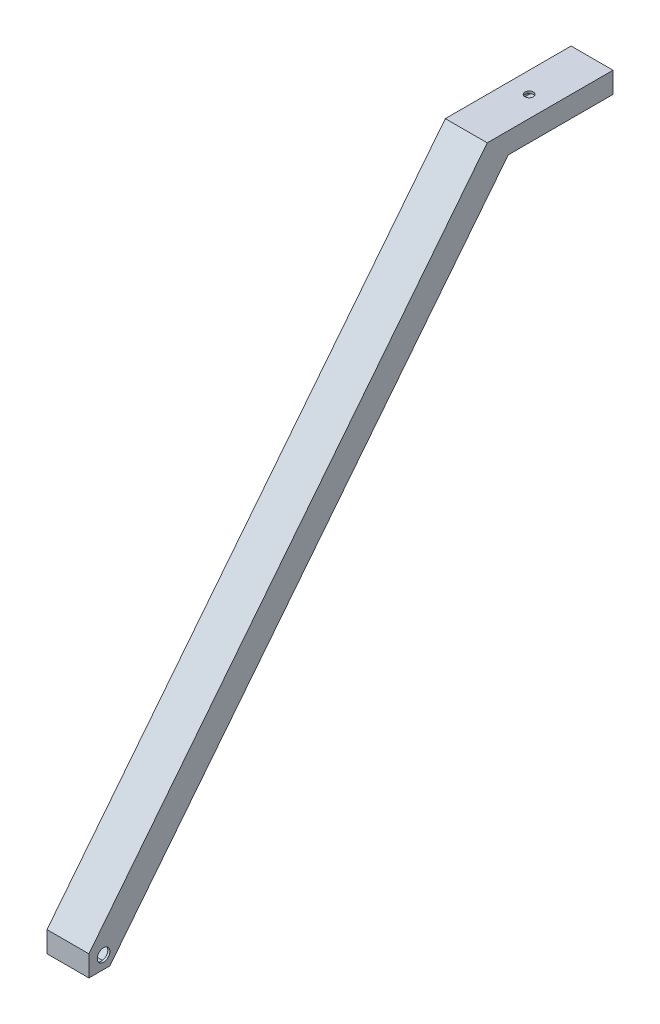
ISO-10303-21;
HEADER;
FILE_DESCRIPTION(('STEP AP214'),'2;1');
FILE_NAME('part.step','',(''),(''),'','','');
FILE_SCHEMA(('AUTOMOTIVE_DESIGN { 1 0 10303 214 1 1 1 1 }'));
ENDSEC;
DATA;
#1=APPLICATION_CONTEXT('core data for automotive mechanical design processes');
#2=APPLICATION_PROTOCOL_DEFINITION('international standard','automotive_design',2000,#1);
#3=PRODUCT_CONTEXT('',#1,'mechanical');
#4=PRODUCT('Part','Part','',(#3));
#5=PRODUCT_RELATED_PRODUCT_CATEGORY('part','',(#4));
#6=PRODUCT_DEFINITION_FORMATION('','',#4);
#7=PRODUCT_DEFINITION_CONTEXT('part definition',#1,'design');
#8=PRODUCT_DEFINITION('design','',#6,#7);
#9=PRODUCT_DEFINITION_SHAPE('','',#8);
#10=(LENGTH_UNIT() NAMED_UNIT(*) SI_UNIT(.MILLI.,.METRE.));
#11=(NAMED_UNIT(*) PLANE_ANGLE_UNIT() SI_UNIT($,.RADIAN.));
#12=(NAMED_UNIT(*) SI_UNIT($,.STERADIAN.) SOLID_ANGLE_UNIT());
#13=UNCERTAINTY_MEASURE_WITH_UNIT(LENGTH_MEASURE(1.E-05),#10,'distance_accuracy_value','');
#14=(GEOMETRIC_REPRESENTATION_CONTEXT(3) GLOBAL_UNCERTAINTY_ASSIGNED_CONTEXT((#13)) GLOBAL_UNIT_ASSIGNED_CONTEXT((#10,
#11,#12)) REPRESENTATION_CONTEXT('',''));
#15=CARTESIAN_POINT('',(0.,0.,0.));
#16=DIRECTION('',(0.,0.,1.));
#17=DIRECTION('',(1.,0.,0.));
#18=AXIS2_PLACEMENT_3D('',#15,#16,#17);
#19=CARTESIAN_POINT('',(10.,10.,0.));
#20=DIRECTION('',(0.,0.,1.));
#21=DIRECTION('',(0.,-1.,0.));
#22=AXIS2_PLACEMENT_3D('',#19,#20,#21);
#23=PLANE('',#22);
#24=DIRECTION('',(0.,1.,0.));
#25=VECTOR('',#24,1.);
#26=CARTESIAN_POINT('',(-10.,10.,0.));
#27=LINE('',#26,#25);
#28=CARTESIAN_POINT('',(-10.,0.,0.));
#29=VERTEX_POINT('',#28);
#30=CARTESIAN_POINT('',(-10.,10.,0.));
#31=VERTEX_POINT('',#30);
#32=EDGE_CURVE('E149',#29,#31,#27,.T.);
#33=ORIENTED_EDGE('',*,*,#32,.T.);
#34=DIRECTION('',(-1.,0.,0.));
#35=VECTOR('',#34,1.);
#36=CARTESIAN_POINT('',(10.,10.,0.));
#37=LINE('',#36,#35);
#38=CARTESIAN_POINT('',(10.,10.,0.));
#39=VERTEX_POINT('',#38);
#40=EDGE_CURVE('E161',#39,#31,#37,.T.);
#41=ORIENTED_EDGE('',*,*,#40,.F.);
#42=DIRECTION('',(0.,1.,0.));
#43=VECTOR('',#42,1.);
#44=CARTESIAN_POINT('',(10.,10.,0.));
#45=LINE('',#44,#43);
#46=CARTESIAN_POINT('',(10.,0.,0.));
#47=VERTEX_POINT('',#46);
#48=EDGE_CURVE('E247',#47,#39,#45,.T.);
#49=ORIENTED_EDGE('',*,*,#48,.F.);
#50=DIRECTION('',(-1.,0.,0.));
#51=VECTOR('',#50,1.);
#52=CARTESIAN_POINT('',(10.,0.,0.));
#53=LINE('',#52,#51);
#54=EDGE_CURVE('E47',#47,#29,#53,.T.);
#55=ORIENTED_EDGE('',*,*,#54,.T.);
#56=EDGE_LOOP('',(#33,#41,#49,#55));
#57=FACE_BOUND('',#56,.T.);
#58=DIRECTION('',(0.,1.,0.));
#59=VECTOR('',#58,1.);
#60=CARTESIAN_POINT('',(-9.,10.,0.));
#61=LINE('',#60,#59);
#62=CARTESIAN_POINT('',(-9.,1.,0.));
#63=VERTEX_POINT('',#62);
#64=CARTESIAN_POINT('',(-9.,9.,0.));
#65=VERTEX_POINT('',#64);
#66=EDGE_CURVE('E205',#63,#65,#61,.T.);
#67=ORIENTED_EDGE('',*,*,#66,.F.);
#68=DIRECTION('',(-1.,0.,0.));
#69=VECTOR('',#68,1.);
#70=CARTESIAN_POINT('',(10.,1.,0.));
#71=LINE('',#70,#69);
#72=CARTESIAN_POINT('',(9.,1.,0.));
#73=VERTEX_POINT('',#72);
#74=EDGE_CURVE('E192',#73,#63,#71,.T.);
#75=ORIENTED_EDGE('',*,*,#74,.F.);
#76=DIRECTION('',(0.,1.,0.));
#77=VECTOR('',#76,1.);
#78=CARTESIAN_POINT('',(9.,10.,0.));
#79=LINE('',#78,#77);
#80=CARTESIAN_POINT('',(9.,9.,0.));
#81=VERTEX_POINT('',#80);
#82=EDGE_CURVE('E55',#73,#81,#79,.T.);
#83=ORIENTED_EDGE('',*,*,#82,.T.);
#84=DIRECTION('',(-1.,0.,0.));
#85=VECTOR('',#84,1.);
#86=CARTESIAN_POINT('',(10.,9.,0.));
#87=LINE('',#86,#85);
#88=EDGE_CURVE('E225',#81,#65,#87,.T.);
#89=ORIENTED_EDGE('',*,*,#88,.T.);
#90=EDGE_LOOP('',(#67,#75,#83,#89));
#91=FACE_BOUND('',#90,.T.);
#92=ADVANCED_FACE('F38',(#57,#91),#23,.F.);
#93=CARTESIAN_POINT('',(10.,0.,50.));
#94=DIRECTION('',(0.,0.620702944365561,0.784045824461761));
#95=DIRECTION('',(0.,-0.784045824461762,0.620702944365561));
#96=AXIS2_PLACEMENT_3D('',#93,#94,#95);
#97=PLANE('',#96);
#98=DIRECTION('',(0.,0.784045824461761,-0.620702944365561));
#99=VECTOR('',#98,1.);
#100=CARTESIAN_POINT('',(-10.,0.,50.));
#101=LINE('',#100,#99);
#102=CARTESIAN_POINT('',(-10.,-240.,240.));
#103=VERTEX_POINT('',#102);
#104=CARTESIAN_POINT('',(-10.,0.,50.));
#105=VERTEX_POINT('',#104);
#106=EDGE_CURVE('E143',#103,#105,#101,.T.);
#107=ORIENTED_EDGE('',*,*,#106,.T.);
#108=DIRECTION('',(-1.,0.,0.));
#109=VECTOR('',#108,1.);
#110=CARTESIAN_POINT('',(10.,0.,50.));
#111=LINE('',#110,#109);
#112=CARTESIAN_POINT('',(10.,0.,50.));
#113=VERTEX_POINT('',#112);
#114=EDGE_CURVE('E11',#113,#105,#111,.T.);
#115=ORIENTED_EDGE('',*,*,#114,.F.);
#116=DIRECTION('',(0.,0.784045824461761,-0.620702944365561));
#117=VECTOR('',#116,1.);
#118=CARTESIAN_POINT('',(10.,0.,50.));
#119=LINE('',#118,#117);
#120=CARTESIAN_POINT('',(10.,-240.,240.));
#121=VERTEX_POINT('',#120);
#122=EDGE_CURVE('E157',#121,#113,#119,.T.);
#123=ORIENTED_EDGE('',*,*,#122,.F.);
#124=DIRECTION('',(-1.,0.,0.));
#125=VECTOR('',#124,1.);
#126=CARTESIAN_POINT('',(10.,-240.,240.));
#127=LINE('',#126,#125);
#128=EDGE_CURVE('E139',#121,#103,#127,.T.);
#129=ORIENTED_EDGE('',*,*,#128,.T.);
#130=EDGE_LOOP('',(#107,#115,#123,#129));
#131=FACE_BOUND('',#130,.T.);
#132=ADVANCED_FACE('F40',(#131),#97,.F.);
#133=CARTESIAN_POINT('',(10.,0.,0.));
#134=DIRECTION('',(0.,1.,0.));
#135=DIRECTION('',(0.,0.,1.));
#136=AXIS2_PLACEMENT_3D('',#133,#134,#135);
#137=PLANE('',#136);
#138=CARTESIAN_POINT('',(0.,0.,30.));
#139=DIRECTION('',(0.,1.,0.));
#140=DIRECTION('',(0.,0.,1.));
#141=AXIS2_PLACEMENT_3D('',#138,#139,#140);
#142=CIRCLE('',#141,2.);
#143=CARTESIAN_POINT('',(0.,0.,32.));
#144=VERTEX_POINT('',#143);
#145=EDGE_CURVE('E172',#144,#144,#142,.T.);
#146=ORIENTED_EDGE('',*,*,#145,.T.);
#147=EDGE_LOOP('',(#146));
#148=FACE_BOUND('',#147,.T.);
#149=DIRECTION('',(0.,0.,-1.));
#150=VECTOR('',#149,1.);
#151=CARTESIAN_POINT('',(-10.,0.,0.));
#152=LINE('',#151,#150);
#153=EDGE_CURVE('E146',#105,#29,#152,.T.);
#154=ORIENTED_EDGE('',*,*,#153,.T.);
#155=ORIENTED_EDGE('',*,*,#54,.F.);
#156=DIRECTION('',(0.,0.,-1.));
#157=VECTOR('',#156,1.);
#158=CARTESIAN_POINT('',(10.,0.,0.));
#159=LINE('',#158,#157);
#160=EDGE_CURVE('E102',#113,#47,#159,.T.);
#161=ORIENTED_EDGE('',*,*,#160,.F.);
#162=ORIENTED_EDGE('',*,*,#114,.T.);
#163=EDGE_LOOP('',(#154,#155,#161,#162));
#164=FACE_BOUND('',#163,.T.);
#165=ADVANCED_FACE('F263',(#148,#164),#137,.F.);
#166=CARTESIAN_POINT('',(10.,10.,60.));
#167=DIRECTION('',(0.,-1.,0.));
#168=DIRECTION('',(0.,0.,-1.));
#169=AXIS2_PLACEMENT_3D('',#166,#167,#168);
#170=PLANE('',#169);
#171=CARTESIAN_POINT('',(0.,10.,30.));
#172=DIRECTION('',(0.,1.,0.));
#173=DIRECTION('',(0.,0.,1.));
#174=AXIS2_PLACEMENT_3D('',#171,#172,#173);
#175=CIRCLE('',#174,2.);
#176=CARTESIAN_POINT('',(0.,10.,32.));
#177=VERTEX_POINT('',#176);
#178=EDGE_CURVE('E168',#177,#177,#175,.T.);
#179=ORIENTED_EDGE('',*,*,#178,.F.);
#180=EDGE_LOOP('',(#179));
#181=FACE_BOUND('',#180,.T.);
#182=DIRECTION('',(0.,0.,1.));
#183=VECTOR('',#182,1.);
#184=CARTESIAN_POINT('',(-10.,10.,60.));
#185=LINE('',#184,#183);
#186=CARTESIAN_POINT('',(-10.,10.,60.));
#187=VERTEX_POINT('',#186);
#188=EDGE_CURVE('E151',#31,#187,#185,.T.);
#189=ORIENTED_EDGE('',*,*,#188,.T.);
#190=DIRECTION('',(-1.,0.,0.));
#191=VECTOR('',#190,1.);
#192=CARTESIAN_POINT('',(10.,10.,60.));
#193=LINE('',#192,#191);
#194=CARTESIAN_POINT('',(10.,10.,60.));
#195=VERTEX_POINT('',#194);
#196=EDGE_CURVE('E134',#195,#187,#193,.T.);
#197=ORIENTED_EDGE('',*,*,#196,.F.);
#198=DIRECTION('',(0.,0.,1.));
#199=VECTOR('',#198,1.);
#200=CARTESIAN_POINT('',(10.,10.,60.));
#201=LINE('',#200,#199);
#202=EDGE_CURVE('E122',#39,#195,#201,.T.);
#203=ORIENTED_EDGE('',*,*,#202,.F.);
#204=ORIENTED_EDGE('',*,*,#40,.T.);
#205=EDGE_LOOP('',(#189,#197,#203,#204));
#206=FACE_BOUND('',#205,.T.);
#207=ADVANCED_FACE('F255',(#181,#206),#170,.F.);
#208=CARTESIAN_POINT('',(10.,-230.,250.));
#209=DIRECTION('',(0.,-0.620702944365561,-0.784045824461761));
#210=DIRECTION('',(0.,0.784045824461762,-0.620702944365561));
#211=AXIS2_PLACEMENT_3D('',#208,#209,#210);
#212=PLANE('',#211);
#213=DIRECTION('',(0.,-0.784045824461761,0.620702944365561));
#214=VECTOR('',#213,1.);
#215=CARTESIAN_POINT('',(-10.,-230.,250.));
#216=LINE('',#215,#214);
#217=CARTESIAN_POINT('',(-10.,-230.,250.));
#218=VERTEX_POINT('',#217);
#219=EDGE_CURVE('E131',#187,#218,#216,.T.);
#220=ORIENTED_EDGE('',*,*,#219,.T.);
#221=DIRECTION('',(-1.,0.,0.));
#222=VECTOR('',#221,1.);
#223=CARTESIAN_POINT('',(10.,-230.,250.));
#224=LINE('',#223,#222);
#225=CARTESIAN_POINT('',(10.,-230.,250.));
#226=VERTEX_POINT('',#225);
#227=EDGE_CURVE('E128',#226,#218,#224,.T.);
#228=ORIENTED_EDGE('',*,*,#227,.F.);
#229=DIRECTION('',(0.,-0.784045824461761,0.620702944365561));
#230=VECTOR('',#229,1.);
#231=CARTESIAN_POINT('',(10.,-230.,250.));
#232=LINE('',#231,#230);
#233=EDGE_CURVE('E115',#195,#226,#232,.T.);
#234=ORIENTED_EDGE('',*,*,#233,.F.);
#235=ORIENTED_EDGE('',*,*,#196,.T.);
#236=EDGE_LOOP('',(#220,#228,#234,#235));
#237=FACE_BOUND('',#236,.T.);
#238=ADVANCED_FACE('F129',(#237),#212,.F.);
#239=CARTESIAN_POINT('',(10.,-230.,250.));
#240=DIRECTION('',(0.,0.,-1.));
#241=DIRECTION('',(0.,1.,0.));
#242=AXIS2_PLACEMENT_3D('',#239,#240,#241);
#243=PLANE('',#242);
#244=DIRECTION('',(0.,-1.,0.));
#245=VECTOR('',#244,1.);
#246=CARTESIAN_POINT('',(-10.,-230.,250.));
#247=LINE('',#246,#245);
#248=CARTESIAN_POINT('',(-10.,-240.,250.));
#249=VERTEX_POINT('',#248);
#250=EDGE_CURVE('E154',#218,#249,#247,.T.);
#251=ORIENTED_EDGE('',*,*,#250,.T.);
#252=DIRECTION('',(-1.,0.,0.));
#253=VECTOR('',#252,1.);
#254=CARTESIAN_POINT('',(10.,-240.,250.));
#255=LINE('',#254,#253);
#256=CARTESIAN_POINT('',(10.,-240.,250.));
#257=VERTEX_POINT('',#256);
#258=EDGE_CURVE('E135',#257,#249,#255,.T.);
#259=ORIENTED_EDGE('',*,*,#258,.F.);
#260=DIRECTION('',(0.,-1.,0.));
#261=VECTOR('',#260,1.);
#262=CARTESIAN_POINT('',(10.,-230.,250.));
#263=LINE('',#262,#261);
#264=EDGE_CURVE('E119',#226,#257,#263,.T.);
#265=ORIENTED_EDGE('',*,*,#264,.F.);
#266=ORIENTED_EDGE('',*,*,#227,.T.);
#267=EDGE_LOOP('',(#251,#259,#265,#266));
#268=FACE_BOUND('',#267,.T.);
#269=ADVANCED_FACE('F137',(#268),#243,.F.);
#270=CARTESIAN_POINT('',(10.,-240.,250.));
#271=DIRECTION('',(0.,1.,0.));
#272=DIRECTION('',(0.,0.,1.));
#273=AXIS2_PLACEMENT_3D('',#270,#271,#272);
#274=PLANE('',#273);
#275=DIRECTION('',(0.,0.,-1.));
#276=VECTOR('',#275,1.);
#277=CARTESIAN_POINT('',(-10.,-240.,250.));
#278=LINE('',#277,#276);
#279=EDGE_CURVE('E94',#249,#103,#278,.T.);
#280=ORIENTED_EDGE('',*,*,#279,.T.);
#281=ORIENTED_EDGE('',*,*,#128,.F.);
#282=DIRECTION('',(0.,0.,-1.));
#283=VECTOR('',#282,1.);
#284=CARTESIAN_POINT('',(10.,-240.,250.));
#285=LINE('',#284,#283);
#286=EDGE_CURVE('E64',#257,#121,#285,.T.);
#287=ORIENTED_EDGE('',*,*,#286,.F.);
#288=ORIENTED_EDGE('',*,*,#258,.T.);
#289=EDGE_LOOP('',(#280,#281,#287,#288));
#290=FACE_BOUND('',#289,.T.);
#291=ADVANCED_FACE('F259',(#290),#274,.F.);
#292=CARTESIAN_POINT('',(10.,0.,0.));
#293=DIRECTION('',(1.,0.,0.));
#294=DIRECTION('',(0.,0.,-1.));
#295=AXIS2_PLACEMENT_3D('',#292,#293,#294);
#296=PLANE('',#295);
#297=CARTESIAN_POINT('',(10.,-234.,243.));
#298=DIRECTION('',(1.,0.,0.));
#299=DIRECTION('',(0.,0.,-1.));
#300=AXIS2_PLACEMENT_3D('',#297,#298,#299);
#301=CIRCLE('',#300,2.99999999999999);
#302=CARTESIAN_POINT('',(10.,-234.,240.));
#303=VERTEX_POINT('',#302);
#304=EDGE_CURVE('E175',#303,#303,#301,.T.);
#305=ORIENTED_EDGE('',*,*,#304,.F.);
#306=EDGE_LOOP('',(#305));
#307=FACE_BOUND('',#306,.T.);
#308=ORIENTED_EDGE('',*,*,#122,.T.);
#309=ORIENTED_EDGE('',*,*,#160,.T.);
#310=ORIENTED_EDGE('',*,*,#48,.T.);
#311=ORIENTED_EDGE('',*,*,#202,.T.);
#312=ORIENTED_EDGE('',*,*,#233,.T.);
#313=ORIENTED_EDGE('',*,*,#264,.T.);
#314=ORIENTED_EDGE('',*,*,#286,.T.);
#315=EDGE_LOOP('',(#308,#309,#310,#311,#312,#313,#314));
#316=FACE_BOUND('',#315,.T.);
#317=ADVANCED_FACE('F117',(#307,#316),#296,.T.);
#318=CARTESIAN_POINT('',(-10.,0.,0.));
#319=DIRECTION('',(1.,0.,0.));
#320=DIRECTION('',(0.,0.,-1.));
#321=AXIS2_PLACEMENT_3D('',#318,#319,#320);
#322=PLANE('',#321);
#323=CARTESIAN_POINT('',(-10.,-234.,243.));
#324=DIRECTION('',(-1.,0.,0.));
#325=DIRECTION('',(0.,0.,1.));
#326=AXIS2_PLACEMENT_3D('',#323,#324,#325);
#327=CIRCLE('',#326,2.99999999999999);
#328=CARTESIAN_POINT('',(-10.,-234.,246.));
#329=VERTEX_POINT('',#328);
#330=EDGE_CURVE('E340',#329,#329,#327,.T.);
#331=ORIENTED_EDGE('',*,*,#330,.F.);
#332=EDGE_LOOP('',(#331));
#333=FACE_BOUND('',#332,.T.);
#334=ORIENTED_EDGE('',*,*,#106,.F.);
#335=ORIENTED_EDGE('',*,*,#279,.F.);
#336=ORIENTED_EDGE('',*,*,#250,.F.);
#337=ORIENTED_EDGE('',*,*,#219,.F.);
#338=ORIENTED_EDGE('',*,*,#188,.F.);
#339=ORIENTED_EDGE('',*,*,#32,.F.);
#340=ORIENTED_EDGE('',*,*,#153,.F.);
#341=EDGE_LOOP('',(#334,#335,#336,#337,#338,#339,#340));
#342=FACE_BOUND('',#341,.T.);
#343=ADVANCED_FACE('F258',(#333,#342),#322,.F.);
#344=CARTESIAN_POINT('',(10.,0.620702944365555,50.7840458244618));
#345=DIRECTION('',(0.,0.620702944365561,0.784045824461761));
#346=DIRECTION('',(0.,-0.784045824461762,0.620702944365561));
#347=AXIS2_PLACEMENT_3D('',#344,#345,#346);
#348=PLANE('',#347);
#349=DIRECTION('',(0.,0.784045824461762,-0.620702944365561));
#350=VECTOR('',#349,1.);
#351=CARTESIAN_POINT('',(-9.,0.620702944365555,50.7840458244618));
#352=LINE('',#351,#350);
#353=CARTESIAN_POINT('',(-9.,-239.,240.483768988751));
#354=VERTEX_POINT('',#353);
#355=CARTESIAN_POINT('',(-9.,0.999999999999994,50.4837689887512));
#356=VERTEX_POINT('',#355);
#357=EDGE_CURVE('E186',#354,#356,#352,.T.);
#358=ORIENTED_EDGE('',*,*,#357,.F.);
#359=DIRECTION('',(-1.,0.,0.));
#360=VECTOR('',#359,1.);
#361=CARTESIAN_POINT('',(10.,-239.,240.483768988751));
#362=LINE('',#361,#360);
#363=CARTESIAN_POINT('',(9.,-239.,240.483768988751));
#364=VERTEX_POINT('',#363);
#365=EDGE_CURVE('E198',#364,#354,#362,.T.);
#366=ORIENTED_EDGE('',*,*,#365,.F.);
#367=DIRECTION('',(0.,0.784045824461762,-0.620702944365561));
#368=VECTOR('',#367,1.);
#369=CARTESIAN_POINT('',(9.,0.620702944365555,50.7840458244618));
#370=LINE('',#369,#368);
#371=CARTESIAN_POINT('',(9.,0.999999999999994,50.4837689887512));
#372=VERTEX_POINT('',#371);
#373=EDGE_CURVE('E193',#364,#372,#370,.T.);
#374=ORIENTED_EDGE('',*,*,#373,.T.);
#375=DIRECTION('',(-1.,0.,0.));
#376=VECTOR('',#375,1.);
#377=CARTESIAN_POINT('',(10.,0.999999999999994,50.4837689887512));
#378=LINE('',#377,#376);
#379=EDGE_CURVE('E147',#372,#356,#378,.T.);
#380=ORIENTED_EDGE('',*,*,#379,.T.);
#381=EDGE_LOOP('',(#358,#366,#374,#380));
#382=FACE_BOUND('',#381,.T.);
#383=ADVANCED_FACE('F285',(#382),#348,.T.);
#384=CARTESIAN_POINT('',(10.,1.,0.));
#385=DIRECTION('',(0.,1.,0.));
#386=DIRECTION('',(0.,0.,1.));
#387=AXIS2_PLACEMENT_3D('',#384,#385,#386);
#388=PLANE('',#387);
#389=CARTESIAN_POINT('',(0.,0.999999999999997,30.));
#390=DIRECTION('',(0.,1.,0.));
#391=DIRECTION('',(0.,0.,1.));
#392=AXIS2_PLACEMENT_3D('',#389,#390,#391);
#393=CIRCLE('',#392,2.);
#394=CARTESIAN_POINT('',(0.,0.999999999999997,32.));
#395=VERTEX_POINT('',#394);
#396=EDGE_CURVE('E167',#395,#395,#393,.T.);
#397=ORIENTED_EDGE('',*,*,#396,.F.);
#398=EDGE_LOOP('',(#397));
#399=FACE_BOUND('',#398,.T.);
#400=DIRECTION('',(0.,0.,-1.));
#401=VECTOR('',#400,1.);
#402=CARTESIAN_POINT('',(-9.,1.,0.));
#403=LINE('',#402,#401);
#404=EDGE_CURVE('E189',#356,#63,#403,.T.);
#405=ORIENTED_EDGE('',*,*,#404,.F.);
#406=ORIENTED_EDGE('',*,*,#379,.F.);
#407=DIRECTION('',(0.,0.,-1.));
#408=VECTOR('',#407,1.);
#409=CARTESIAN_POINT('',(9.,1.,0.));
#410=LINE('',#409,#408);
#411=EDGE_CURVE('E196',#372,#73,#410,.T.);
#412=ORIENTED_EDGE('',*,*,#411,.T.);
#413=ORIENTED_EDGE('',*,*,#74,.T.);
#414=EDGE_LOOP('',(#405,#406,#412,#413));
#415=FACE_BOUND('',#414,.T.);
#416=ADVANCED_FACE('F314',(#399,#415),#388,.T.);
#417=CARTESIAN_POINT('',(10.,9.,60.));
#418=DIRECTION('',(0.,-1.,0.));
#419=DIRECTION('',(0.,0.,-1.));
#420=AXIS2_PLACEMENT_3D('',#417,#418,#419);
#421=PLANE('',#420);
#422=CARTESIAN_POINT('',(0.,9.,30.));
#423=DIRECTION('',(0.,-1.,0.));
#424=DIRECTION('',(0.,0.,-1.));
#425=AXIS2_PLACEMENT_3D('',#422,#423,#424);
#426=CIRCLE('',#425,2.);
#427=CARTESIAN_POINT('',(0.,9.,28.));
#428=VERTEX_POINT('',#427);
#429=EDGE_CURVE('E165',#428,#428,#426,.T.);
#430=ORIENTED_EDGE('',*,*,#429,.F.);
#431=EDGE_LOOP('',(#430));
#432=FACE_BOUND('',#431,.T.);
#433=DIRECTION('',(0.,0.,1.));
#434=VECTOR('',#433,1.);
#435=CARTESIAN_POINT('',(-9.,9.,60.));
#436=LINE('',#435,#434);
#437=CARTESIAN_POINT('',(-9.,9.,59.5162310112488));
#438=VERTEX_POINT('',#437);
#439=EDGE_CURVE('E218',#65,#438,#436,.T.);
#440=ORIENTED_EDGE('',*,*,#439,.F.);
#441=ORIENTED_EDGE('',*,*,#88,.F.);
#442=DIRECTION('',(0.,0.,1.));
#443=VECTOR('',#442,1.);
#444=CARTESIAN_POINT('',(9.,9.,60.));
#445=LINE('',#444,#443);
#446=CARTESIAN_POINT('',(9.,9.,59.5162310112488));
#447=VERTEX_POINT('',#446);
#448=EDGE_CURVE('E207',#81,#447,#445,.T.);
#449=ORIENTED_EDGE('',*,*,#448,.T.);
#450=DIRECTION('',(-1.,0.,0.));
#451=VECTOR('',#450,1.);
#452=CARTESIAN_POINT('',(10.,9.00000000000001,59.5162310112488));
#453=LINE('',#452,#451);
#454=EDGE_CURVE('E222',#447,#438,#453,.T.);
#455=ORIENTED_EDGE('',*,*,#454,.T.);
#456=EDGE_LOOP('',(#440,#441,#449,#455));
#457=FACE_BOUND('',#456,.T.);
#458=ADVANCED_FACE('F310',(#432,#457),#421,.T.);
#459=CARTESIAN_POINT('',(10.,-230.620702944366,249.215954175538));
#460=DIRECTION('',(0.,-0.620702944365561,-0.784045824461761));
#461=DIRECTION('',(0.,0.784045824461762,-0.620702944365561));
#462=AXIS2_PLACEMENT_3D('',#459,#460,#461);
#463=PLANE('',#462);
#464=DIRECTION('',(0.,-0.784045824461762,0.620702944365561));
#465=VECTOR('',#464,1.);
#466=CARTESIAN_POINT('',(-9.,-230.620702944366,249.215954175538));
#467=LINE('',#466,#465);
#468=CARTESIAN_POINT('',(-9.,-230.347918722633,249.));
#469=VERTEX_POINT('',#468);
#470=EDGE_CURVE('E221',#438,#469,#467,.T.);
#471=ORIENTED_EDGE('',*,*,#470,.F.);
#472=ORIENTED_EDGE('',*,*,#454,.F.);
#473=DIRECTION('',(0.,-0.784045824461762,0.620702944365561));
#474=VECTOR('',#473,1.);
#475=CARTESIAN_POINT('',(9.,-230.620702944366,249.215954175538));
#476=LINE('',#475,#474);
#477=CARTESIAN_POINT('',(9.,-230.347918722633,249.));
#478=VERTEX_POINT('',#477);
#479=EDGE_CURVE('E210',#447,#478,#476,.T.);
#480=ORIENTED_EDGE('',*,*,#479,.T.);
#481=DIRECTION('',(-1.,0.,0.));
#482=VECTOR('',#481,1.);
#483=CARTESIAN_POINT('',(10.,-230.347918722633,249.));
#484=LINE('',#483,#482);
#485=EDGE_CURVE('E226',#478,#469,#484,.T.);
#486=ORIENTED_EDGE('',*,*,#485,.T.);
#487=EDGE_LOOP('',(#471,#472,#480,#486));
#488=FACE_BOUND('',#487,.T.);
#489=ADVANCED_FACE('F306',(#488),#463,.T.);
#490=CARTESIAN_POINT('',(10.,-230.,249.));
#491=DIRECTION('',(0.,0.,-1.));
#492=DIRECTION('',(0.,1.,0.));
#493=AXIS2_PLACEMENT_3D('',#490,#491,#492);
#494=PLANE('',#493);
#495=DIRECTION('',(0.,-1.,0.));
#496=VECTOR('',#495,1.);
#497=CARTESIAN_POINT('',(-9.,-230.,249.));
#498=LINE('',#497,#496);
#499=CARTESIAN_POINT('',(-9.,-239.,249.));
#500=VERTEX_POINT('',#499);
#501=EDGE_CURVE('E229',#469,#500,#498,.T.);
#502=ORIENTED_EDGE('',*,*,#501,.F.);
#503=ORIENTED_EDGE('',*,*,#485,.F.);
#504=DIRECTION('',(0.,-1.,0.));
#505=VECTOR('',#504,1.);
#506=CARTESIAN_POINT('',(9.,-230.,249.));
#507=LINE('',#506,#505);
#508=CARTESIAN_POINT('',(9.,-239.,249.));
#509=VERTEX_POINT('',#508);
#510=EDGE_CURVE('E213',#478,#509,#507,.T.);
#511=ORIENTED_EDGE('',*,*,#510,.T.);
#512=DIRECTION('',(-1.,0.,0.));
#513=VECTOR('',#512,1.);
#514=CARTESIAN_POINT('',(10.,-239.,249.));
#515=LINE('',#514,#513);
#516=EDGE_CURVE('E201',#509,#500,#515,.T.);
#517=ORIENTED_EDGE('',*,*,#516,.T.);
#518=EDGE_LOOP('',(#502,#503,#511,#517));
#519=FACE_BOUND('',#518,.T.);
#520=ADVANCED_FACE('F302',(#519),#494,.T.);
#521=CARTESIAN_POINT('',(10.,-239.,250.));
#522=DIRECTION('',(0.,1.,0.));
#523=DIRECTION('',(0.,0.,1.));
#524=AXIS2_PLACEMENT_3D('',#521,#522,#523);
#525=PLANE('',#524);
#526=DIRECTION('',(0.,0.,-1.));
#527=VECTOR('',#526,1.);
#528=CARTESIAN_POINT('',(-9.,-239.,250.));
#529=LINE('',#528,#527);
#530=EDGE_CURVE('E197',#500,#354,#529,.T.);
#531=ORIENTED_EDGE('',*,*,#530,.F.);
#532=ORIENTED_EDGE('',*,*,#516,.F.);
#533=DIRECTION('',(0.,0.,-1.));
#534=VECTOR('',#533,1.);
#535=CARTESIAN_POINT('',(9.,-239.,250.));
#536=LINE('',#535,#534);
#537=EDGE_CURVE('E202',#509,#364,#536,.T.);
#538=ORIENTED_EDGE('',*,*,#537,.T.);
#539=ORIENTED_EDGE('',*,*,#365,.T.);
#540=EDGE_LOOP('',(#531,#532,#538,#539));
#541=FACE_BOUND('',#540,.T.);
#542=ADVANCED_FACE('F298',(#541),#525,.T.);
#543=CARTESIAN_POINT('',(9.,0.,0.));
#544=DIRECTION('',(1.,0.,0.));
#545=DIRECTION('',(0.,0.,-1.));
#546=AXIS2_PLACEMENT_3D('',#543,#544,#545);
#547=PLANE('',#546);
#548=CARTESIAN_POINT('',(9.,-234.,243.));
#549=DIRECTION('',(1.,0.,0.));
#550=DIRECTION('',(0.,0.,-1.));
#551=AXIS2_PLACEMENT_3D('',#548,#549,#550);
#552=CIRCLE('',#551,2.99999999999999);
#553=CARTESIAN_POINT('',(9.,-234.,240.));
#554=VERTEX_POINT('',#553);
#555=EDGE_CURVE('E180',#554,#554,#552,.T.);
#556=ORIENTED_EDGE('',*,*,#555,.T.);
#557=EDGE_LOOP('',(#556));
#558=FACE_BOUND('',#557,.T.);
#559=ORIENTED_EDGE('',*,*,#373,.F.);
#560=ORIENTED_EDGE('',*,*,#537,.F.);
#561=ORIENTED_EDGE('',*,*,#510,.F.);
#562=ORIENTED_EDGE('',*,*,#479,.F.);
#563=ORIENTED_EDGE('',*,*,#448,.F.);
#564=ORIENTED_EDGE('',*,*,#82,.F.);
#565=ORIENTED_EDGE('',*,*,#411,.F.);
#566=EDGE_LOOP('',(#559,#560,#561,#562,#563,#564,#565));
#567=FACE_BOUND('',#566,.T.);
#568=ADVANCED_FACE('F294',(#558,#567),#547,.F.);
#569=CARTESIAN_POINT('',(-9.,0.,0.));
#570=DIRECTION('',(1.,0.,0.));
#571=DIRECTION('',(0.,0.,-1.));
#572=AXIS2_PLACEMENT_3D('',#569,#570,#571);
#573=PLANE('',#572);
#574=CARTESIAN_POINT('',(-9.,-234.,243.));
#575=DIRECTION('',(1.,0.,0.));
#576=DIRECTION('',(0.,0.,-1.));
#577=AXIS2_PLACEMENT_3D('',#574,#575,#576);
#578=CIRCLE('',#577,2.99999999999999);
#579=CARTESIAN_POINT('',(-9.,-234.,240.));
#580=VERTEX_POINT('',#579);
#581=EDGE_CURVE('E42',#580,#580,#578,.T.);
#582=ORIENTED_EDGE('',*,*,#581,.F.);
#583=EDGE_LOOP('',(#582));
#584=FACE_BOUND('',#583,.T.);
#585=ORIENTED_EDGE('',*,*,#357,.T.);
#586=ORIENTED_EDGE('',*,*,#404,.T.);
#587=ORIENTED_EDGE('',*,*,#66,.T.);
#588=ORIENTED_EDGE('',*,*,#439,.T.);
#589=ORIENTED_EDGE('',*,*,#470,.T.);
#590=ORIENTED_EDGE('',*,*,#501,.T.);
#591=ORIENTED_EDGE('',*,*,#530,.T.);
#592=EDGE_LOOP('',(#585,#586,#587,#588,#589,#590,#591));
#593=FACE_BOUND('',#592,.T.);
#594=ADVANCED_FACE('F290',(#584,#593),#573,.T.);
#595=CARTESIAN_POINT('',(0.,-17.,30.));
#596=DIRECTION('',(0.,1.,0.));
#597=DIRECTION('',(0.,0.,1.));
#598=AXIS2_PLACEMENT_3D('',#595,#596,#597);
#599=CYLINDRICAL_SURFACE('',#598,2.);
#600=ORIENTED_EDGE('',*,*,#429,.T.);
#601=EDGE_LOOP('',(#600));
#602=FACE_BOUND('',#601,.T.);
#603=ORIENTED_EDGE('',*,*,#178,.T.);
#604=EDGE_LOOP('',(#603));
#605=FACE_BOUND('',#604,.T.);
#606=ADVANCED_FACE('F293',(#602,#605),#599,.F.);
#607=ORIENTED_EDGE('',*,*,#396,.T.);
#608=EDGE_LOOP('',(#607));
#609=FACE_BOUND('',#608,.T.);
#610=ORIENTED_EDGE('',*,*,#145,.F.);
#611=EDGE_LOOP('',(#610));
#612=FACE_BOUND('',#611,.T.);
#613=ADVANCED_FACE('F324',(#609,#612),#599,.F.);
#614=CARTESIAN_POINT('',(27.,-234.,243.));
#615=DIRECTION('',(-1.,0.,0.));
#616=DIRECTION('',(0.,0.,1.));
#617=AXIS2_PLACEMENT_3D('',#614,#615,#616);
#618=CYLINDRICAL_SURFACE('',#617,2.99999999999999);
#619=ORIENTED_EDGE('',*,*,#581,.T.);
#620=EDGE_LOOP('',(#619));
#621=FACE_BOUND('',#620,.T.);
#622=ORIENTED_EDGE('',*,*,#330,.T.);
#623=EDGE_LOOP('',(#622));
#624=FACE_BOUND('',#623,.T.);
#625=ADVANCED_FACE('F325',(#621,#624),#618,.F.);
#626=ORIENTED_EDGE('',*,*,#304,.T.);
#627=EDGE_LOOP('',(#626));
#628=FACE_BOUND('',#627,.T.);
#629=ORIENTED_EDGE('',*,*,#555,.F.);
#630=EDGE_LOOP('',(#629));
#631=FACE_BOUND('',#630,.T.);
#632=ADVANCED_FACE('F327',(#628,#631),#618,.F.);
#633=CLOSED_SHELL('',(#92,#132,#165,#207,#238,#269,#291,#317,#343,#383,#416,#458,#489,#520,#542,
#568,#594,#606,#613,#625,#632));
#634=MANIFOLD_SOLID_BREP('B2',#633);
#635=ADVANCED_BREP_SHAPE_REPRESENTATION('',(#18,#634),#14);
#636=SHAPE_DEFINITION_REPRESENTATION(#9,#635);
ENDSEC;
END-ISO-10303-21;
